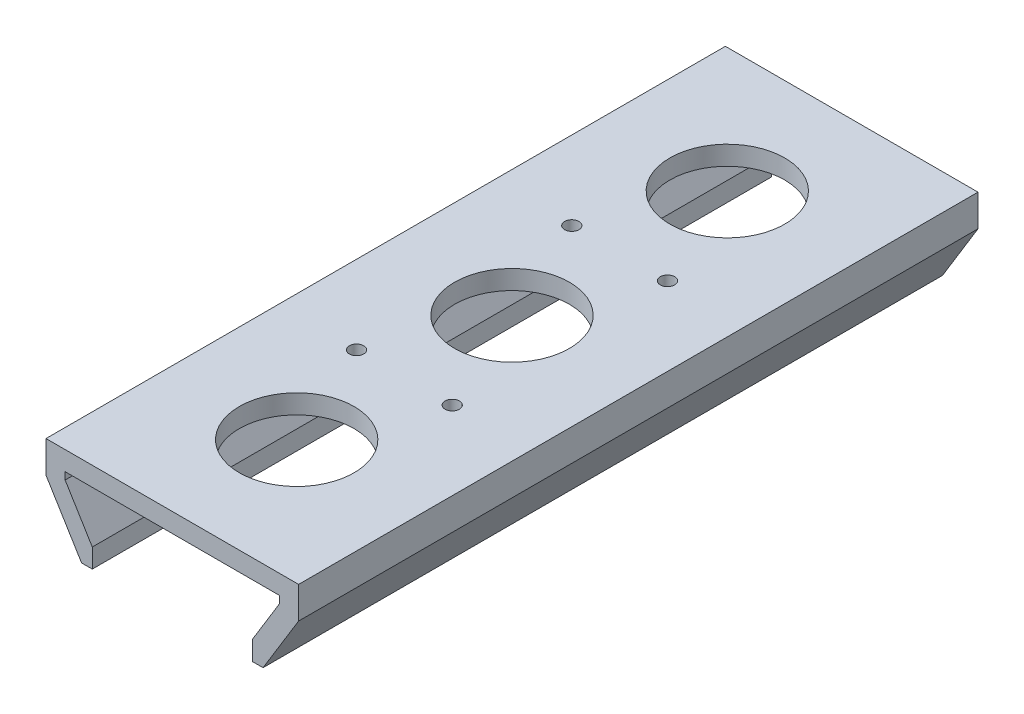
ISO-10303-21;
HEADER;
FILE_DESCRIPTION(('STEP AP214'),'2;1');
FILE_NAME('part.step','',(''),(''),'','','');
FILE_SCHEMA(('AUTOMOTIVE_DESIGN { 1 0 10303 214 1 1 1 1 }'));
ENDSEC;
DATA;
#1=APPLICATION_CONTEXT('core data for automotive mechanical design processes');
#2=APPLICATION_PROTOCOL_DEFINITION('international standard','automotive_design',2000,#1);
#3=PRODUCT_CONTEXT('',#1,'mechanical');
#4=PRODUCT('Part','Part','',(#3));
#5=PRODUCT_RELATED_PRODUCT_CATEGORY('part','',(#4));
#6=PRODUCT_DEFINITION_FORMATION('','',#4);
#7=PRODUCT_DEFINITION_CONTEXT('part definition',#1,'design');
#8=PRODUCT_DEFINITION('design','',#6,#7);
#9=PRODUCT_DEFINITION_SHAPE('','',#8);
#10=(LENGTH_UNIT() NAMED_UNIT(*) SI_UNIT(.MILLI.,.METRE.));
#11=(NAMED_UNIT(*) PLANE_ANGLE_UNIT() SI_UNIT($,.RADIAN.));
#12=(NAMED_UNIT(*) SI_UNIT($,.STERADIAN.) SOLID_ANGLE_UNIT());
#13=UNCERTAINTY_MEASURE_WITH_UNIT(LENGTH_MEASURE(1.E-05),#10,'distance_accuracy_value','');
#14=(GEOMETRIC_REPRESENTATION_CONTEXT(3) GLOBAL_UNCERTAINTY_ASSIGNED_CONTEXT((#13)) GLOBAL_UNIT_ASSIGNED_CONTEXT((#10,
#11,#12)) REPRESENTATION_CONTEXT('',''));
#15=CARTESIAN_POINT('',(0.,0.,0.));
#16=DIRECTION('',(0.,0.,1.));
#17=DIRECTION('',(1.,0.,0.));
#18=AXIS2_PLACEMENT_3D('',#15,#16,#17);
#19=CARTESIAN_POINT('',(0.,-13.08935446553,142.));
#20=DIRECTION('',(0.,-1.,0.));
#21=DIRECTION('',(1.,0.,0.));
#22=AXIS2_PLACEMENT_3D('',#19,#20,#21);
#23=PLANE('',#22);
#24=CARTESIAN_POINT('',(-9.99999999999999,-13.08935446553,48.5));
#25=DIRECTION('',(0.,-1.,0.));
#26=DIRECTION('',(1.,0.,0.));
#27=AXIS2_PLACEMENT_3D('',#24,#25,#26);
#28=CIRCLE('',#27,1.5);
#29=CARTESIAN_POINT('',(-8.49999999999999,-13.08935446553,48.5));
#30=VERTEX_POINT('',#29);
#31=EDGE_CURVE('E344',#30,#30,#28,.F.);
#32=ORIENTED_EDGE('',*,*,#31,.T.);
#33=EDGE_LOOP('',(#32));
#34=FACE_BOUND('',#33,.T.);
#35=CARTESIAN_POINT('',(10.,-13.08935446553,93.5));
#36=DIRECTION('',(0.,-1.,0.));
#37=DIRECTION('',(1.,0.,0.));
#38=AXIS2_PLACEMENT_3D('',#35,#36,#37);
#39=CIRCLE('',#38,1.5);
#40=CARTESIAN_POINT('',(11.5,-13.08935446553,93.5));
#41=VERTEX_POINT('',#40);
#42=EDGE_CURVE('E348',#41,#41,#39,.F.);
#43=ORIENTED_EDGE('',*,*,#42,.T.);
#44=EDGE_LOOP('',(#43));
#45=FACE_BOUND('',#44,.T.);
#46=CARTESIAN_POINT('',(0.,-13.08935446553,26.));
#47=DIRECTION('',(0.,-1.,0.));
#48=DIRECTION('',(1.,0.,0.));
#49=AXIS2_PLACEMENT_3D('',#46,#47,#48);
#50=CIRCLE('',#49,12.);
#51=CARTESIAN_POINT('',(12.,-13.08935446553,26.));
#52=VERTEX_POINT('',#51);
#53=EDGE_CURVE('E183',#52,#52,#50,.T.);
#54=ORIENTED_EDGE('',*,*,#53,.F.);
#55=EDGE_LOOP('',(#54));
#56=FACE_BOUND('',#55,.T.);
#57=CARTESIAN_POINT('',(0.,-13.08935446553,71.));
#58=DIRECTION('',(0.,-1.,0.));
#59=DIRECTION('',(1.,0.,0.));
#60=AXIS2_PLACEMENT_3D('',#57,#58,#59);
#61=CIRCLE('',#60,12.);
#62=CARTESIAN_POINT('',(12.,-13.08935446553,71.));
#63=VERTEX_POINT('',#62);
#64=EDGE_CURVE('E355',#63,#63,#61,.T.);
#65=ORIENTED_EDGE('',*,*,#64,.F.);
#66=EDGE_LOOP('',(#65));
#67=FACE_BOUND('',#66,.T.);
#68=CARTESIAN_POINT('',(0.,-13.08935446553,116.));
#69=DIRECTION('',(0.,-1.,0.));
#70=DIRECTION('',(1.,0.,0.));
#71=AXIS2_PLACEMENT_3D('',#68,#69,#70);
#72=CIRCLE('',#71,12.);
#73=CARTESIAN_POINT('',(12.,-13.08935446553,116.));
#74=VERTEX_POINT('',#73);
#75=EDGE_CURVE('E358',#74,#74,#72,.T.);
#76=ORIENTED_EDGE('',*,*,#75,.F.);
#77=EDGE_LOOP('',(#76));
#78=FACE_BOUND('',#77,.T.);
#79=DIRECTION('',(-1.,0.,0.));
#80=VECTOR('',#79,1.);
#81=CARTESIAN_POINT('',(0.,-13.08935446553,0.));
#82=LINE('',#81,#80);
#83=CARTESIAN_POINT('',(22.4,-13.08935446553,0.));
#84=VERTEX_POINT('',#83);
#85=CARTESIAN_POINT('',(-22.4,-13.08935446553,0.));
#86=VERTEX_POINT('',#85);
#87=EDGE_CURVE('E179',#84,#86,#82,.T.);
#88=ORIENTED_EDGE('',*,*,#87,.F.);
#89=DIRECTION('',(0.,0.,-1.));
#90=VECTOR('',#89,1.);
#91=CARTESIAN_POINT('',(22.4,-13.08935446553,142.));
#92=LINE('',#91,#90);
#93=CARTESIAN_POINT('',(22.4,-13.08935446553,142.));
#94=VERTEX_POINT('',#93);
#95=EDGE_CURVE('E11',#94,#84,#92,.T.);
#96=ORIENTED_EDGE('',*,*,#95,.F.);
#97=DIRECTION('',(-1.,0.,0.));
#98=VECTOR('',#97,1.);
#99=CARTESIAN_POINT('',(0.,-13.08935446553,142.));
#100=LINE('',#99,#98);
#101=CARTESIAN_POINT('',(-22.4,-13.08935446553,142.));
#102=VERTEX_POINT('',#101);
#103=EDGE_CURVE('E228',#94,#102,#100,.T.);
#104=ORIENTED_EDGE('',*,*,#103,.T.);
#105=DIRECTION('',(0.,0.,-1.));
#106=VECTOR('',#105,1.);
#107=CARTESIAN_POINT('',(-22.4,-13.08935446553,142.));
#108=LINE('',#107,#106);
#109=EDGE_CURVE('E62',#102,#86,#108,.T.);
#110=ORIENTED_EDGE('',*,*,#109,.T.);
#111=EDGE_LOOP('',(#88,#96,#104,#110));
#112=FACE_BOUND('',#111,.T.);
#113=CARTESIAN_POINT('',(-9.99999999999999,-13.08935446553,93.5));
#114=DIRECTION('',(0.,-1.,0.));
#115=DIRECTION('',(1.,0.,0.));
#116=AXIS2_PLACEMENT_3D('',#113,#114,#115);
#117=CIRCLE('',#116,1.5);
#118=CARTESIAN_POINT('',(-8.49999999999999,-13.08935446553,93.5));
#119=VERTEX_POINT('',#118);
#120=EDGE_CURVE('E363',#119,#119,#117,.T.);
#121=ORIENTED_EDGE('',*,*,#120,.F.);
#122=EDGE_LOOP('',(#121));
#123=FACE_BOUND('',#122,.T.);
#124=CARTESIAN_POINT('',(10.,-13.08935446553,48.5));
#125=DIRECTION('',(0.,-1.,0.));
#126=DIRECTION('',(1.,0.,0.));
#127=AXIS2_PLACEMENT_3D('',#124,#125,#126);
#128=CIRCLE('',#127,1.5);
#129=CARTESIAN_POINT('',(11.5,-13.08935446553,48.5));
#130=VERTEX_POINT('',#129);
#131=EDGE_CURVE('E366',#130,#130,#128,.T.);
#132=ORIENTED_EDGE('',*,*,#131,.F.);
#133=EDGE_LOOP('',(#132));
#134=FACE_BOUND('',#133,.T.);
#135=ADVANCED_FACE('F45',(#34,#45,#56,#67,#78,#112,#123,#134),#23,.T.);
#136=CARTESIAN_POINT('',(0.,-9.08935446553003,142.));
#137=DIRECTION('',(0.,1.,0.));
#138=DIRECTION('',(0.,0.,1.));
#139=AXIS2_PLACEMENT_3D('',#136,#137,#138);
#140=PLANE('',#139);
#141=CARTESIAN_POINT('',(-9.99999999999999,-9.08935446553003,48.5));
#142=DIRECTION('',(0.,-1.,0.));
#143=DIRECTION('',(1.,0.,0.));
#144=AXIS2_PLACEMENT_3D('',#141,#142,#143);
#145=CIRCLE('',#144,1.5);
#146=CARTESIAN_POINT('',(-8.49999999999999,-9.08935446553003,48.5));
#147=VERTEX_POINT('',#146);
#148=EDGE_CURVE('E638',#147,#147,#145,.T.);
#149=ORIENTED_EDGE('',*,*,#148,.T.);
#150=EDGE_LOOP('',(#149));
#151=FACE_BOUND('',#150,.T.);
#152=CARTESIAN_POINT('',(10.,-9.08935446553004,93.5));
#153=DIRECTION('',(0.,-1.,0.));
#154=DIRECTION('',(1.,0.,0.));
#155=AXIS2_PLACEMENT_3D('',#152,#153,#154);
#156=CIRCLE('',#155,1.5);
#157=CARTESIAN_POINT('',(11.5,-9.08935446553004,93.5));
#158=VERTEX_POINT('',#157);
#159=EDGE_CURVE('E646',#158,#158,#156,.T.);
#160=ORIENTED_EDGE('',*,*,#159,.T.);
#161=EDGE_LOOP('',(#160));
#162=FACE_BOUND('',#161,.T.);
#163=CARTESIAN_POINT('',(0.,-9.08935446553003,26.));
#164=DIRECTION('',(0.,1.,0.));
#165=DIRECTION('',(-1.,0.,0.));
#166=AXIS2_PLACEMENT_3D('',#163,#164,#165);
#167=CIRCLE('',#166,12.);
#168=CARTESIAN_POINT('',(-12.,-9.08935446553003,26.));
#169=VERTEX_POINT('',#168);
#170=EDGE_CURVE('E379',#169,#169,#167,.T.);
#171=ORIENTED_EDGE('',*,*,#170,.F.);
#172=EDGE_LOOP('',(#171));
#173=FACE_BOUND('',#172,.T.);
#174=CARTESIAN_POINT('',(0.,-9.08935446553003,71.));
#175=DIRECTION('',(0.,1.,0.));
#176=DIRECTION('',(-1.,0.,0.));
#177=AXIS2_PLACEMENT_3D('',#174,#175,#176);
#178=CIRCLE('',#177,12.);
#179=CARTESIAN_POINT('',(-12.,-9.08935446553003,71.));
#180=VERTEX_POINT('',#179);
#181=EDGE_CURVE('E374',#180,#180,#178,.T.);
#182=ORIENTED_EDGE('',*,*,#181,.F.);
#183=EDGE_LOOP('',(#182));
#184=FACE_BOUND('',#183,.T.);
#185=CARTESIAN_POINT('',(0.,-9.08935446553003,116.));
#186=DIRECTION('',(0.,1.,0.));
#187=DIRECTION('',(-1.,0.,0.));
#188=AXIS2_PLACEMENT_3D('',#185,#186,#187);
#189=CIRCLE('',#188,12.);
#190=CARTESIAN_POINT('',(-12.,-9.08935446553003,116.));
#191=VERTEX_POINT('',#190);
#192=EDGE_CURVE('E369',#191,#191,#189,.T.);
#193=ORIENTED_EDGE('',*,*,#192,.F.);
#194=EDGE_LOOP('',(#193));
#195=FACE_BOUND('',#194,.T.);
#196=DIRECTION('',(1.,0.,0.));
#197=VECTOR('',#196,1.);
#198=CARTESIAN_POINT('',(0.,-9.08935446553003,0.));
#199=LINE('',#198,#197);
#200=CARTESIAN_POINT('',(-26.4,-9.08935446553003,0.));
#201=VERTEX_POINT('',#200);
#202=CARTESIAN_POINT('',(26.4,-9.08935446553003,0.));
#203=VERTEX_POINT('',#202);
#204=EDGE_CURVE('E205',#201,#203,#199,.T.);
#205=ORIENTED_EDGE('',*,*,#204,.F.);
#206=DIRECTION('',(0.,0.,-1.));
#207=VECTOR('',#206,1.);
#208=CARTESIAN_POINT('',(-26.4,-9.08935446553003,142.));
#209=LINE('',#208,#207);
#210=CARTESIAN_POINT('',(-26.4,-9.08935446553003,142.));
#211=VERTEX_POINT('',#210);
#212=EDGE_CURVE('E243',#211,#201,#209,.T.);
#213=ORIENTED_EDGE('',*,*,#212,.F.);
#214=DIRECTION('',(1.,0.,0.));
#215=VECTOR('',#214,1.);
#216=CARTESIAN_POINT('',(0.,-9.08935446553003,142.));
#217=LINE('',#216,#215);
#218=CARTESIAN_POINT('',(26.4,-9.08935446553003,142.));
#219=VERTEX_POINT('',#218);
#220=EDGE_CURVE('E301',#211,#219,#217,.T.);
#221=ORIENTED_EDGE('',*,*,#220,.T.);
#222=DIRECTION('',(0.,0.,-1.));
#223=VECTOR('',#222,1.);
#224=CARTESIAN_POINT('',(26.4,-9.08935446553003,142.));
#225=LINE('',#224,#223);
#226=EDGE_CURVE('E246',#219,#203,#225,.T.);
#227=ORIENTED_EDGE('',*,*,#226,.T.);
#228=EDGE_LOOP('',(#205,#213,#221,#227));
#229=FACE_BOUND('',#228,.T.);
#230=CARTESIAN_POINT('',(-9.99999999999999,-9.08935446553003,93.5));
#231=DIRECTION('',(0.,1.,0.));
#232=DIRECTION('',(-1.,0.,0.));
#233=AXIS2_PLACEMENT_3D('',#230,#231,#232);
#234=CIRCLE('',#233,1.5);
#235=CARTESIAN_POINT('',(-11.5,-9.08935446553003,93.5));
#236=VERTEX_POINT('',#235);
#237=EDGE_CURVE('E642',#236,#236,#234,.T.);
#238=ORIENTED_EDGE('',*,*,#237,.F.);
#239=EDGE_LOOP('',(#238));
#240=FACE_BOUND('',#239,.T.);
#241=CARTESIAN_POINT('',(10.,-9.08935446553004,48.5));
#242=DIRECTION('',(0.,1.,0.));
#243=DIRECTION('',(-1.,0.,0.));
#244=AXIS2_PLACEMENT_3D('',#241,#242,#243);
#245=CIRCLE('',#244,1.5);
#246=CARTESIAN_POINT('',(8.5,-9.08935446553004,48.5));
#247=VERTEX_POINT('',#246);
#248=EDGE_CURVE('E635',#247,#247,#245,.T.);
#249=ORIENTED_EDGE('',*,*,#248,.F.);
#250=EDGE_LOOP('',(#249));
#251=FACE_BOUND('',#250,.T.);
#252=ADVANCED_FACE('F333',(#151,#162,#173,#184,#195,#229,#240,#251),#140,.T.);
#253=CARTESIAN_POINT('',(22.4,0.,142.));
#254=DIRECTION('',(1.,0.,0.));
#255=DIRECTION('',(0.,0.,-1.));
#256=AXIS2_PLACEMENT_3D('',#253,#254,#255);
#257=PLANE('',#256);
#258=DIRECTION('',(0.,-1.,0.));
#259=VECTOR('',#258,1.);
#260=CARTESIAN_POINT('',(22.4,0.,0.));
#261=LINE('',#260,#259);
#262=CARTESIAN_POINT('',(22.4,-14.6019007604293,0.));
#263=VERTEX_POINT('',#262);
#264=EDGE_CURVE('E182',#84,#263,#261,.T.);
#265=ORIENTED_EDGE('',*,*,#264,.T.);
#266=DIRECTION('',(0.,0.,-1.));
#267=VECTOR('',#266,1.);
#268=CARTESIAN_POINT('',(22.4,-14.6019007604293,142.));
#269=LINE('',#268,#267);
#270=CARTESIAN_POINT('',(22.4,-14.6019007604293,142.));
#271=VERTEX_POINT('',#270);
#272=EDGE_CURVE('E54',#271,#263,#269,.T.);
#273=ORIENTED_EDGE('',*,*,#272,.F.);
#274=DIRECTION('',(0.,-1.,0.));
#275=VECTOR('',#274,1.);
#276=CARTESIAN_POINT('',(22.4,0.,142.));
#277=LINE('',#276,#275);
#278=EDGE_CURVE('E290',#94,#271,#277,.T.);
#279=ORIENTED_EDGE('',*,*,#278,.F.);
#280=ORIENTED_EDGE('',*,*,#95,.T.);
#281=EDGE_LOOP('',(#265,#273,#279,#280));
#282=FACE_BOUND('',#281,.T.);
#283=ADVANCED_FACE('F338',(#282),#257,.F.);
#284=CARTESIAN_POINT('',(22.8062389900337,-13.937146049465,142.));
#285=DIRECTION('',(0.853281833651959,-0.521450009453975,0.));
#286=DIRECTION('',(0.521450009453975,0.853281833651959,0.));
#287=AXIS2_PLACEMENT_3D('',#284,#285,#286);
#288=PLANE('',#287);
#289=DIRECTION('',(-0.521450009453975,-0.853281833651959,0.));
#290=VECTOR('',#289,1.);
#291=CARTESIAN_POINT('',(22.8062389900337,-13.937146049465,0.));
#292=LINE('',#291,#290);
#293=CARTESIAN_POINT('',(16.7243338468829,-23.88935446553,0.));
#294=VERTEX_POINT('',#293);
#295=EDGE_CURVE('E186',#263,#294,#292,.T.);
#296=ORIENTED_EDGE('',*,*,#295,.T.);
#297=DIRECTION('',(0.,0.,-1.));
#298=VECTOR('',#297,1.);
#299=CARTESIAN_POINT('',(16.7243338468829,-23.88935446553,142.));
#300=LINE('',#299,#298);
#301=CARTESIAN_POINT('',(16.7243338468829,-23.88935446553,142.));
#302=VERTEX_POINT('',#301);
#303=EDGE_CURVE('E258',#302,#294,#300,.T.);
#304=ORIENTED_EDGE('',*,*,#303,.F.);
#305=DIRECTION('',(-0.521450009453975,-0.853281833651959,0.));
#306=VECTOR('',#305,1.);
#307=CARTESIAN_POINT('',(22.8062389900337,-13.937146049465,142.));
#308=LINE('',#307,#306);
#309=EDGE_CURVE('E269',#271,#302,#308,.T.);
#310=ORIENTED_EDGE('',*,*,#309,.F.);
#311=ORIENTED_EDGE('',*,*,#272,.T.);
#312=EDGE_LOOP('',(#296,#304,#310,#311));
#313=FACE_BOUND('',#312,.T.);
#314=ADVANCED_FACE('F267',(#313),#288,.F.);
#315=CARTESIAN_POINT('',(16.7243338468829,0.,142.));
#316=DIRECTION('',(1.,0.,0.));
#317=DIRECTION('',(0.,0.,-1.));
#318=AXIS2_PLACEMENT_3D('',#315,#316,#317);
#319=PLANE('',#318);
#320=DIRECTION('',(0.,-1.,0.));
#321=VECTOR('',#320,1.);
#322=CARTESIAN_POINT('',(16.7243338468829,0.,0.));
#323=LINE('',#322,#321);
#324=CARTESIAN_POINT('',(16.7243338468829,-27.88935446553,0.));
#325=VERTEX_POINT('',#324);
#326=EDGE_CURVE('E189',#294,#325,#323,.T.);
#327=ORIENTED_EDGE('',*,*,#326,.T.);
#328=DIRECTION('',(0.,0.,-1.));
#329=VECTOR('',#328,1.);
#330=CARTESIAN_POINT('',(16.7243338468829,-27.88935446553,142.));
#331=LINE('',#330,#329);
#332=CARTESIAN_POINT('',(16.7243338468829,-27.88935446553,142.));
#333=VERTEX_POINT('',#332);
#334=EDGE_CURVE('E255',#333,#325,#331,.T.);
#335=ORIENTED_EDGE('',*,*,#334,.F.);
#336=DIRECTION('',(0.,-1.,0.));
#337=VECTOR('',#336,1.);
#338=CARTESIAN_POINT('',(16.7243338468829,0.,142.));
#339=LINE('',#338,#337);
#340=EDGE_CURVE('E281',#302,#333,#339,.T.);
#341=ORIENTED_EDGE('',*,*,#340,.F.);
#342=ORIENTED_EDGE('',*,*,#303,.T.);
#343=EDGE_LOOP('',(#327,#335,#341,#342));
#344=FACE_BOUND('',#343,.T.);
#345=ADVANCED_FACE('F278',(#344),#319,.F.);
#346=CARTESIAN_POINT('',(0.,-27.88935446553,142.));
#347=DIRECTION('',(0.,-1.,0.));
#348=DIRECTION('',(0.,0.,-1.));
#349=AXIS2_PLACEMENT_3D('',#346,#347,#348);
#350=PLANE('',#349);
#351=DIRECTION('',(-1.,0.,0.));
#352=VECTOR('',#351,1.);
#353=CARTESIAN_POINT('',(0.,-27.88935446553,0.));
#354=LINE('',#353,#352);
#355=CARTESIAN_POINT('',(18.9676723157115,-27.88935446553,0.));
#356=VERTEX_POINT('',#355);
#357=EDGE_CURVE('E193',#356,#325,#354,.T.);
#358=ORIENTED_EDGE('',*,*,#357,.F.);
#359=DIRECTION('',(0.,0.,-1.));
#360=VECTOR('',#359,1.);
#361=CARTESIAN_POINT('',(18.9676723157115,-27.88935446553,142.));
#362=LINE('',#361,#360);
#363=CARTESIAN_POINT('',(18.9676723157115,-27.88935446553,142.));
#364=VERTEX_POINT('',#363);
#365=EDGE_CURVE('E252',#364,#356,#362,.T.);
#366=ORIENTED_EDGE('',*,*,#365,.F.);
#367=DIRECTION('',(-1.,0.,0.));
#368=VECTOR('',#367,1.);
#369=CARTESIAN_POINT('',(0.,-27.88935446553,142.));
#370=LINE('',#369,#368);
#371=EDGE_CURVE('E284',#364,#333,#370,.T.);
#372=ORIENTED_EDGE('',*,*,#371,.T.);
#373=ORIENTED_EDGE('',*,*,#334,.T.);
#374=EDGE_LOOP('',(#358,#366,#372,#373));
#375=FACE_BOUND('',#374,.T.);
#376=ADVANCED_FACE('F402',(#375),#350,.T.);
#377=CARTESIAN_POINT('',(26.2193663246415,-16.0229460872809,142.));
#378=DIRECTION('',(0.853281833651959,-0.521450009453975,0.));
#379=DIRECTION('',(0.521450009453975,0.853281833651959,0.));
#380=AXIS2_PLACEMENT_3D('',#377,#378,#379);
#381=PLANE('',#380);
#382=DIRECTION('',(-0.521450009453975,-0.853281833651959,0.));
#383=VECTOR('',#382,1.);
#384=CARTESIAN_POINT('',(26.2193663246415,-16.0229460872809,0.));
#385=LINE('',#384,#383);
#386=CARTESIAN_POINT('',(26.4,-15.7273637094216,0.));
#387=VERTEX_POINT('',#386);
#388=EDGE_CURVE('E197',#387,#356,#385,.T.);
#389=ORIENTED_EDGE('',*,*,#388,.F.);
#390=DIRECTION('',(0.,0.,-1.));
#391=VECTOR('',#390,1.);
#392=CARTESIAN_POINT('',(26.4,-15.7273637094216,142.));
#393=LINE('',#392,#391);
#394=CARTESIAN_POINT('',(26.4,-15.7273637094216,142.));
#395=VERTEX_POINT('',#394);
#396=EDGE_CURVE('E249',#395,#387,#393,.T.);
#397=ORIENTED_EDGE('',*,*,#396,.F.);
#398=DIRECTION('',(-0.521450009453975,-0.853281833651959,0.));
#399=VECTOR('',#398,1.);
#400=CARTESIAN_POINT('',(26.2193663246415,-16.0229460872809,142.));
#401=LINE('',#400,#399);
#402=EDGE_CURVE('E288',#395,#364,#401,.T.);
#403=ORIENTED_EDGE('',*,*,#402,.T.);
#404=ORIENTED_EDGE('',*,*,#365,.T.);
#405=EDGE_LOOP('',(#389,#397,#403,#404));
#406=FACE_BOUND('',#405,.T.);
#407=ADVANCED_FACE('F405',(#406),#381,.T.);
#408=CARTESIAN_POINT('',(26.4,0.,142.));
#409=DIRECTION('',(1.,0.,0.));
#410=DIRECTION('',(0.,0.,-1.));
#411=AXIS2_PLACEMENT_3D('',#408,#409,#410);
#412=PLANE('',#411);
#413=DIRECTION('',(0.,-1.,0.));
#414=VECTOR('',#413,1.);
#415=CARTESIAN_POINT('',(26.4,0.,0.));
#416=LINE('',#415,#414);
#417=EDGE_CURVE('E201',#203,#387,#416,.T.);
#418=ORIENTED_EDGE('',*,*,#417,.F.);
#419=ORIENTED_EDGE('',*,*,#226,.F.);
#420=DIRECTION('',(0.,-1.,0.));
#421=VECTOR('',#420,1.);
#422=CARTESIAN_POINT('',(26.4,0.,142.));
#423=LINE('',#422,#421);
#424=EDGE_CURVE('E297',#219,#395,#423,.T.);
#425=ORIENTED_EDGE('',*,*,#424,.T.);
#426=ORIENTED_EDGE('',*,*,#396,.T.);
#427=EDGE_LOOP('',(#418,#419,#425,#426));
#428=FACE_BOUND('',#427,.T.);
#429=ADVANCED_FACE('F409',(#428),#412,.T.);
#430=CARTESIAN_POINT('',(-26.4,0.,142.));
#431=DIRECTION('',(1.,0.,0.));
#432=DIRECTION('',(0.,0.,-1.));
#433=AXIS2_PLACEMENT_3D('',#430,#431,#432);
#434=PLANE('',#433);
#435=DIRECTION('',(0.,-1.,0.));
#436=VECTOR('',#435,1.);
#437=CARTESIAN_POINT('',(-26.4,0.,0.));
#438=LINE('',#437,#436);
#439=CARTESIAN_POINT('',(-26.4,-15.7273637094216,0.));
#440=VERTEX_POINT('',#439);
#441=EDGE_CURVE('E209',#201,#440,#438,.T.);
#442=ORIENTED_EDGE('',*,*,#441,.T.);
#443=DIRECTION('',(0.,0.,-1.));
#444=VECTOR('',#443,1.);
#445=CARTESIAN_POINT('',(-26.4,-15.7273637094216,142.));
#446=LINE('',#445,#444);
#447=CARTESIAN_POINT('',(-26.4,-15.7273637094216,142.));
#448=VERTEX_POINT('',#447);
#449=EDGE_CURVE('E239',#448,#440,#446,.T.);
#450=ORIENTED_EDGE('',*,*,#449,.F.);
#451=DIRECTION('',(0.,-1.,0.));
#452=VECTOR('',#451,1.);
#453=CARTESIAN_POINT('',(-26.4,0.,142.));
#454=LINE('',#453,#452);
#455=EDGE_CURVE('E305',#211,#448,#454,.T.);
#456=ORIENTED_EDGE('',*,*,#455,.F.);
#457=ORIENTED_EDGE('',*,*,#212,.T.);
#458=EDGE_LOOP('',(#442,#450,#456,#457));
#459=FACE_BOUND('',#458,.T.);
#460=ADVANCED_FACE('F412',(#459),#434,.F.);
#461=CARTESIAN_POINT('',(-26.2193663246415,-16.0229460872809,142.));
#462=DIRECTION('',(0.853281833651959,0.521450009453975,0.));
#463=DIRECTION('',(-0.521450009453975,0.853281833651959,0.));
#464=AXIS2_PLACEMENT_3D('',#461,#462,#463);
#465=PLANE('',#464);
#466=DIRECTION('',(0.521450009453975,-0.853281833651959,0.));
#467=VECTOR('',#466,1.);
#468=CARTESIAN_POINT('',(-26.2193663246415,-16.0229460872809,0.));
#469=LINE('',#468,#467);
#470=CARTESIAN_POINT('',(-18.9676723157115,-27.88935446553,0.));
#471=VERTEX_POINT('',#470);
#472=EDGE_CURVE('E212',#440,#471,#469,.T.);
#473=ORIENTED_EDGE('',*,*,#472,.T.);
#474=DIRECTION('',(0.,0.,-1.));
#475=VECTOR('',#474,1.);
#476=CARTESIAN_POINT('',(-18.9676723157115,-27.88935446553,142.));
#477=LINE('',#476,#475);
#478=CARTESIAN_POINT('',(-18.9676723157115,-27.88935446553,142.));
#479=VERTEX_POINT('',#478);
#480=EDGE_CURVE('E235',#479,#471,#477,.T.);
#481=ORIENTED_EDGE('',*,*,#480,.F.);
#482=DIRECTION('',(0.521450009453975,-0.853281833651959,0.));
#483=VECTOR('',#482,1.);
#484=CARTESIAN_POINT('',(-26.2193663246415,-16.0229460872809,142.));
#485=LINE('',#484,#483);
#486=EDGE_CURVE('E308',#448,#479,#485,.T.);
#487=ORIENTED_EDGE('',*,*,#486,.F.);
#488=ORIENTED_EDGE('',*,*,#449,.T.);
#489=EDGE_LOOP('',(#473,#481,#487,#488));
#490=FACE_BOUND('',#489,.T.);
#491=ADVANCED_FACE('F317',(#490),#465,.F.);
#492=CARTESIAN_POINT('',(0.,-27.88935446553,142.));
#493=DIRECTION('',(0.,1.,0.));
#494=DIRECTION('',(0.,0.,1.));
#495=AXIS2_PLACEMENT_3D('',#492,#493,#494);
#496=PLANE('',#495);
#497=DIRECTION('',(1.,0.,0.));
#498=VECTOR('',#497,1.);
#499=CARTESIAN_POINT('',(0.,-27.88935446553,0.));
#500=LINE('',#499,#498);
#501=CARTESIAN_POINT('',(-16.7243338468829,-27.88935446553,0.));
#502=VERTEX_POINT('',#501);
#503=EDGE_CURVE('E215',#471,#502,#500,.T.);
#504=ORIENTED_EDGE('',*,*,#503,.T.);
#505=DIRECTION('',(0.,0.,-1.));
#506=VECTOR('',#505,1.);
#507=CARTESIAN_POINT('',(-16.7243338468829,-27.88935446553,142.));
#508=LINE('',#507,#506);
#509=CARTESIAN_POINT('',(-16.7243338468829,-27.88935446553,142.));
#510=VERTEX_POINT('',#509);
#511=EDGE_CURVE('E158',#510,#502,#508,.T.);
#512=ORIENTED_EDGE('',*,*,#511,.F.);
#513=DIRECTION('',(1.,0.,0.));
#514=VECTOR('',#513,1.);
#515=CARTESIAN_POINT('',(0.,-27.88935446553,142.));
#516=LINE('',#515,#514);
#517=EDGE_CURVE('E167',#479,#510,#516,.T.);
#518=ORIENTED_EDGE('',*,*,#517,.F.);
#519=ORIENTED_EDGE('',*,*,#480,.T.);
#520=EDGE_LOOP('',(#504,#512,#518,#519));
#521=FACE_BOUND('',#520,.T.);
#522=ADVANCED_FACE('F321',(#521),#496,.F.);
#523=CARTESIAN_POINT('',(-16.7243338468829,0.,142.));
#524=DIRECTION('',(1.,0.,0.));
#525=DIRECTION('',(0.,0.,-1.));
#526=AXIS2_PLACEMENT_3D('',#523,#524,#525);
#527=PLANE('',#526);
#528=DIRECTION('',(0.,-1.,0.));
#529=VECTOR('',#528,1.);
#530=CARTESIAN_POINT('',(-16.7243338468829,0.,0.));
#531=LINE('',#530,#529);
#532=CARTESIAN_POINT('',(-16.7243338468829,-23.88935446553,0.));
#533=VERTEX_POINT('',#532);
#534=EDGE_CURVE('E153',#533,#502,#531,.T.);
#535=ORIENTED_EDGE('',*,*,#534,.F.);
#536=DIRECTION('',(0.,0.,-1.));
#537=VECTOR('',#536,1.);
#538=CARTESIAN_POINT('',(-16.7243338468829,-23.88935446553,142.));
#539=LINE('',#538,#537);
#540=CARTESIAN_POINT('',(-16.7243338468829,-23.88935446553,142.));
#541=VERTEX_POINT('',#540);
#542=EDGE_CURVE('E148',#541,#533,#539,.T.);
#543=ORIENTED_EDGE('',*,*,#542,.F.);
#544=DIRECTION('',(0.,-1.,0.));
#545=VECTOR('',#544,1.);
#546=CARTESIAN_POINT('',(-16.7243338468829,0.,142.));
#547=LINE('',#546,#545);
#548=EDGE_CURVE('E151',#541,#510,#547,.T.);
#549=ORIENTED_EDGE('',*,*,#548,.T.);
#550=ORIENTED_EDGE('',*,*,#511,.T.);
#551=EDGE_LOOP('',(#535,#543,#549,#550));
#552=FACE_BOUND('',#551,.T.);
#553=ADVANCED_FACE('F150',(#552),#527,.T.);
#554=CARTESIAN_POINT('',(-22.8062389900337,-13.937146049465,142.));
#555=DIRECTION('',(0.853281833651959,0.521450009453975,0.));
#556=DIRECTION('',(-0.521450009453975,0.853281833651959,0.));
#557=AXIS2_PLACEMENT_3D('',#554,#555,#556);
#558=PLANE('',#557);
#559=DIRECTION('',(0.521450009453975,-0.853281833651959,0.));
#560=VECTOR('',#559,1.);
#561=CARTESIAN_POINT('',(-22.8062389900337,-13.937146049465,0.));
#562=LINE('',#561,#560);
#563=CARTESIAN_POINT('',(-22.4,-14.6019007604293,0.));
#564=VERTEX_POINT('',#563);
#565=EDGE_CURVE('E221',#564,#533,#562,.T.);
#566=ORIENTED_EDGE('',*,*,#565,.F.);
#567=DIRECTION('',(0.,0.,-1.));
#568=VECTOR('',#567,1.);
#569=CARTESIAN_POINT('',(-22.4,-14.6019007604293,142.));
#570=LINE('',#569,#568);
#571=CARTESIAN_POINT('',(-22.4,-14.6019007604293,142.));
#572=VERTEX_POINT('',#571);
#573=EDGE_CURVE('E105',#572,#564,#570,.T.);
#574=ORIENTED_EDGE('',*,*,#573,.F.);
#575=DIRECTION('',(0.521450009453975,-0.853281833651959,0.));
#576=VECTOR('',#575,1.);
#577=CARTESIAN_POINT('',(-22.8062389900337,-13.937146049465,142.));
#578=LINE('',#577,#576);
#579=EDGE_CURVE('E165',#572,#541,#578,.T.);
#580=ORIENTED_EDGE('',*,*,#579,.T.);
#581=ORIENTED_EDGE('',*,*,#542,.T.);
#582=EDGE_LOOP('',(#566,#574,#580,#581));
#583=FACE_BOUND('',#582,.T.);
#584=ADVANCED_FACE('F171',(#583),#558,.T.);
#585=CARTESIAN_POINT('',(-22.4,0.,142.));
#586=DIRECTION('',(1.,0.,0.));
#587=DIRECTION('',(0.,0.,-1.));
#588=AXIS2_PLACEMENT_3D('',#585,#586,#587);
#589=PLANE('',#588);
#590=DIRECTION('',(0.,-1.,0.));
#591=VECTOR('',#590,1.);
#592=CARTESIAN_POINT('',(-22.4,0.,0.));
#593=LINE('',#592,#591);
#594=EDGE_CURVE('E224',#86,#564,#593,.T.);
#595=ORIENTED_EDGE('',*,*,#594,.F.);
#596=ORIENTED_EDGE('',*,*,#109,.F.);
#597=DIRECTION('',(0.,-1.,0.));
#598=VECTOR('',#597,1.);
#599=CARTESIAN_POINT('',(-22.4,0.,142.));
#600=LINE('',#599,#598);
#601=EDGE_CURVE('E173',#102,#572,#600,.T.);
#602=ORIENTED_EDGE('',*,*,#601,.T.);
#603=ORIENTED_EDGE('',*,*,#573,.T.);
#604=EDGE_LOOP('',(#595,#596,#602,#603));
#605=FACE_BOUND('',#604,.T.);
#606=ADVANCED_FACE('F322',(#605),#589,.T.);
#607=CARTESIAN_POINT('',(0.,0.,142.));
#608=DIRECTION('',(0.,0.,1.));
#609=DIRECTION('',(1.,0.,0.));
#610=AXIS2_PLACEMENT_3D('',#607,#608,#609);
#611=PLANE('',#610);
#612=ORIENTED_EDGE('',*,*,#103,.F.);
#613=ORIENTED_EDGE('',*,*,#278,.T.);
#614=ORIENTED_EDGE('',*,*,#309,.T.);
#615=ORIENTED_EDGE('',*,*,#340,.T.);
#616=ORIENTED_EDGE('',*,*,#371,.F.);
#617=ORIENTED_EDGE('',*,*,#402,.F.);
#618=ORIENTED_EDGE('',*,*,#424,.F.);
#619=ORIENTED_EDGE('',*,*,#220,.F.);
#620=ORIENTED_EDGE('',*,*,#455,.T.);
#621=ORIENTED_EDGE('',*,*,#486,.T.);
#622=ORIENTED_EDGE('',*,*,#517,.T.);
#623=ORIENTED_EDGE('',*,*,#548,.F.);
#624=ORIENTED_EDGE('',*,*,#579,.F.);
#625=ORIENTED_EDGE('',*,*,#601,.F.);
#626=EDGE_LOOP('',(#612,#613,#614,#615,#616,#617,#618,#619,#620,#621,#622,#623,#624,#625));
#627=FACE_BOUND('',#626,.T.);
#628=ADVANCED_FACE('F163',(#627),#611,.T.);
#629=CARTESIAN_POINT('',(0.,0.,0.));
#630=DIRECTION('',(0.,0.,1.));
#631=DIRECTION('',(1.,0.,0.));
#632=AXIS2_PLACEMENT_3D('',#629,#630,#631);
#633=PLANE('',#632);
#634=ORIENTED_EDGE('',*,*,#87,.T.);
#635=ORIENTED_EDGE('',*,*,#594,.T.);
#636=ORIENTED_EDGE('',*,*,#565,.T.);
#637=ORIENTED_EDGE('',*,*,#534,.T.);
#638=ORIENTED_EDGE('',*,*,#503,.F.);
#639=ORIENTED_EDGE('',*,*,#472,.F.);
#640=ORIENTED_EDGE('',*,*,#441,.F.);
#641=ORIENTED_EDGE('',*,*,#204,.T.);
#642=ORIENTED_EDGE('',*,*,#417,.T.);
#643=ORIENTED_EDGE('',*,*,#388,.T.);
#644=ORIENTED_EDGE('',*,*,#357,.T.);
#645=ORIENTED_EDGE('',*,*,#326,.F.);
#646=ORIENTED_EDGE('',*,*,#295,.F.);
#647=ORIENTED_EDGE('',*,*,#264,.F.);
#648=EDGE_LOOP('',(#634,#635,#636,#637,#638,#639,#640,#641,#642,#643,#644,#645,#646,#647));
#649=FACE_BOUND('',#648,.T.);
#650=ADVANCED_FACE('F274',(#649),#633,.F.);
#651=CARTESIAN_POINT('',(0.,-222.08935446553,116.));
#652=DIRECTION('',(0.,1.,0.));
#653=DIRECTION('',(-1.,0.,0.));
#654=AXIS2_PLACEMENT_3D('',#651,#652,#653);
#655=CYLINDRICAL_SURFACE('',#654,12.);
#656=ORIENTED_EDGE('',*,*,#75,.T.);
#657=EDGE_LOOP('',(#656));
#658=FACE_BOUND('',#657,.T.);
#659=ORIENTED_EDGE('',*,*,#192,.T.);
#660=EDGE_LOOP('',(#659));
#661=FACE_BOUND('',#660,.T.);
#662=ADVANCED_FACE('F453',(#658,#661),#655,.F.);
#663=CARTESIAN_POINT('',(0.,-222.08935446553,71.));
#664=DIRECTION('',(0.,1.,0.));
#665=DIRECTION('',(-1.,0.,0.));
#666=AXIS2_PLACEMENT_3D('',#663,#664,#665);
#667=CYLINDRICAL_SURFACE('',#666,12.);
#668=ORIENTED_EDGE('',*,*,#64,.T.);
#669=EDGE_LOOP('',(#668));
#670=FACE_BOUND('',#669,.T.);
#671=ORIENTED_EDGE('',*,*,#181,.T.);
#672=EDGE_LOOP('',(#671));
#673=FACE_BOUND('',#672,.T.);
#674=ADVANCED_FACE('F462',(#670,#673),#667,.F.);
#675=CARTESIAN_POINT('',(0.,-222.08935446553,26.));
#676=DIRECTION('',(0.,1.,0.));
#677=DIRECTION('',(-1.,0.,0.));
#678=AXIS2_PLACEMENT_3D('',#675,#676,#677);
#679=CYLINDRICAL_SURFACE('',#678,12.);
#680=ORIENTED_EDGE('',*,*,#53,.T.);
#681=EDGE_LOOP('',(#680));
#682=FACE_BOUND('',#681,.T.);
#683=ORIENTED_EDGE('',*,*,#170,.T.);
#684=EDGE_LOOP('',(#683));
#685=FACE_BOUND('',#684,.T.);
#686=ADVANCED_FACE('F473',(#682,#685),#679,.F.);
#687=CARTESIAN_POINT('',(10.,-19.08935446553,93.5));
#688=DIRECTION('',(0.,1.,0.));
#689=DIRECTION('',(-1.,0.,0.));
#690=AXIS2_PLACEMENT_3D('',#687,#688,#689);
#691=CYLINDRICAL_SURFACE('',#690,1.5);
#692=ORIENTED_EDGE('',*,*,#42,.F.);
#693=EDGE_LOOP('',(#692));
#694=FACE_BOUND('',#693,.T.);
#695=ORIENTED_EDGE('',*,*,#159,.F.);
#696=EDGE_LOOP('',(#695));
#697=FACE_BOUND('',#696,.T.);
#698=ADVANCED_FACE('F483',(#694,#697),#691,.F.);
#699=CARTESIAN_POINT('',(-9.99999999999999,-19.08935446553,93.5));
#700=DIRECTION('',(0.,1.,0.));
#701=DIRECTION('',(-1.,0.,0.));
#702=AXIS2_PLACEMENT_3D('',#699,#700,#701);
#703=CYLINDRICAL_SURFACE('',#702,1.5);
#704=ORIENTED_EDGE('',*,*,#120,.T.);
#705=EDGE_LOOP('',(#704));
#706=FACE_BOUND('',#705,.T.);
#707=ORIENTED_EDGE('',*,*,#237,.T.);
#708=EDGE_LOOP('',(#707));
#709=FACE_BOUND('',#708,.T.);
#710=ADVANCED_FACE('F507',(#706,#709),#703,.F.);
#711=CARTESIAN_POINT('',(-9.99999999999999,-19.08935446553,48.5));
#712=DIRECTION('',(0.,1.,0.));
#713=DIRECTION('',(-1.,0.,0.));
#714=AXIS2_PLACEMENT_3D('',#711,#712,#713);
#715=CYLINDRICAL_SURFACE('',#714,1.5);
#716=ORIENTED_EDGE('',*,*,#31,.F.);
#717=EDGE_LOOP('',(#716));
#718=FACE_BOUND('',#717,.T.);
#719=ORIENTED_EDGE('',*,*,#148,.F.);
#720=EDGE_LOOP('',(#719));
#721=FACE_BOUND('',#720,.T.);
#722=ADVANCED_FACE('F518',(#718,#721),#715,.F.);
#723=CARTESIAN_POINT('',(10.,-19.08935446553,48.5));
#724=DIRECTION('',(0.,1.,0.));
#725=DIRECTION('',(-1.,0.,0.));
#726=AXIS2_PLACEMENT_3D('',#723,#724,#725);
#727=CYLINDRICAL_SURFACE('',#726,1.5);
#728=ORIENTED_EDGE('',*,*,#131,.T.);
#729=EDGE_LOOP('',(#728));
#730=FACE_BOUND('',#729,.T.);
#731=ORIENTED_EDGE('',*,*,#248,.T.);
#732=EDGE_LOOP('',(#731));
#733=FACE_BOUND('',#732,.T.);
#734=ADVANCED_FACE('F529',(#730,#733),#727,.F.);
#735=CLOSED_SHELL('',(#135,#252,#283,#314,#345,#376,#407,#429,#460,#491,#522,#553,#584,#606,
#628,#650,#662,#674,#686,#698,#710,#722,#734));
#736=MANIFOLD_SOLID_BREP('B2',#735);
#737=ADVANCED_BREP_SHAPE_REPRESENTATION('',(#18,#736),#14);
#738=SHAPE_DEFINITION_REPRESENTATION(#9,#737);
ENDSEC;
END-ISO-10303-21;
